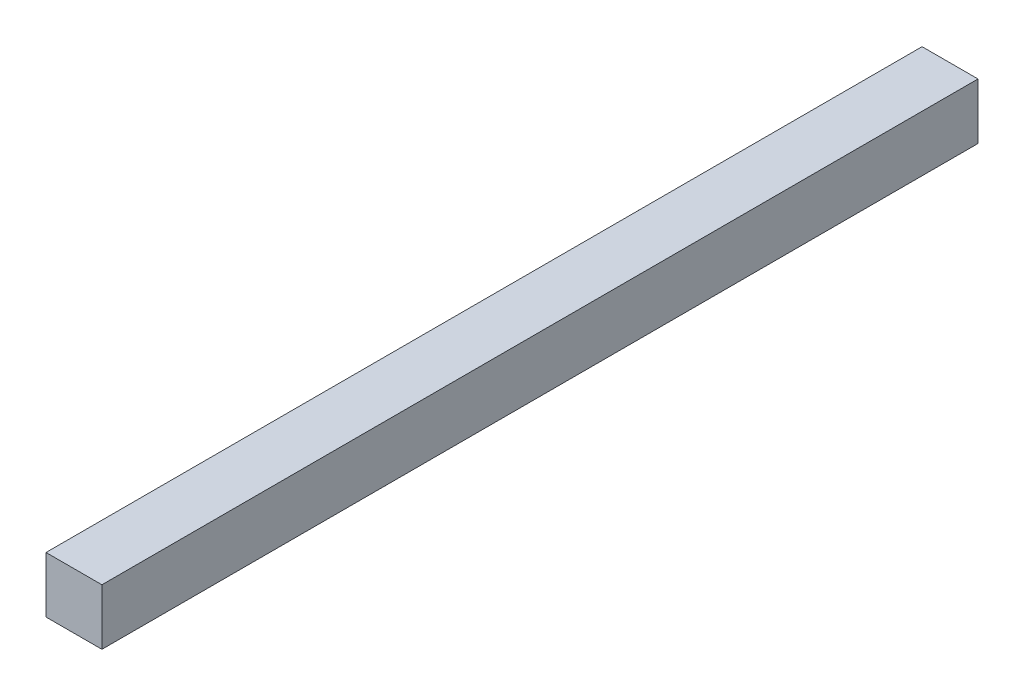
ISO-10303-21;
HEADER;
FILE_DESCRIPTION(('STEP AP214'),'2;1');
FILE_NAME('part.step','',(''),(''),'','','');
FILE_SCHEMA(('AUTOMOTIVE_DESIGN { 1 0 10303 214 1 1 1 1 }'));
ENDSEC;
DATA;
#1=APPLICATION_CONTEXT('core data for automotive mechanical design processes');
#2=APPLICATION_PROTOCOL_DEFINITION('international standard','automotive_design',2000,#1);
#3=PRODUCT_CONTEXT('',#1,'mechanical');
#4=PRODUCT('Part','Part','',(#3));
#5=PRODUCT_RELATED_PRODUCT_CATEGORY('part','',(#4));
#6=PRODUCT_DEFINITION_FORMATION('','',#4);
#7=PRODUCT_DEFINITION_CONTEXT('part definition',#1,'design');
#8=PRODUCT_DEFINITION('design','',#6,#7);
#9=PRODUCT_DEFINITION_SHAPE('','',#8);
#10=(LENGTH_UNIT() NAMED_UNIT(*) SI_UNIT(.MILLI.,.METRE.));
#11=(NAMED_UNIT(*) PLANE_ANGLE_UNIT() SI_UNIT($,.RADIAN.));
#12=(NAMED_UNIT(*) SI_UNIT($,.STERADIAN.) SOLID_ANGLE_UNIT());
#13=UNCERTAINTY_MEASURE_WITH_UNIT(LENGTH_MEASURE(1.E-05),#10,'distance_accuracy_value','');
#14=(GEOMETRIC_REPRESENTATION_CONTEXT(3) GLOBAL_UNCERTAINTY_ASSIGNED_CONTEXT((#13)) GLOBAL_UNIT_ASSIGNED_CONTEXT((#10,
#11,#12)) REPRESENTATION_CONTEXT('',''));
#15=CARTESIAN_POINT('',(0.,0.,0.));
#16=DIRECTION('',(0.,0.,1.));
#17=DIRECTION('',(1.,0.,0.));
#18=AXIS2_PLACEMENT_3D('',#15,#16,#17);
#19=CARTESIAN_POINT('',(-19.5762350936968,22.7172061328773,470.));
#20=DIRECTION('',(1.,0.,0.));
#21=DIRECTION('',(0.,1.,0.));
#22=AXIS2_PLACEMENT_3D('',#19,#20,#21);
#23=PLANE('',#22);
#24=DIRECTION('',(0.,-1.,0.));
#25=VECTOR('',#24,1.);
#26=CARTESIAN_POINT('',(-19.5762350936968,22.7172061328773,0.));
#27=LINE('',#26,#25);
#28=CARTESIAN_POINT('',(-19.5762350936968,22.7172061328773,0.));
#29=VERTEX_POINT('',#28);
#30=CARTESIAN_POINT('',(-19.5762350936968,-7.2827938671227,0.));
#31=VERTEX_POINT('',#30);
#32=EDGE_CURVE('E96',#29,#31,#27,.T.);
#33=ORIENTED_EDGE('',*,*,#32,.T.);
#34=DIRECTION('',(0.,0.,-1.));
#35=VECTOR('',#34,1.);
#36=CARTESIAN_POINT('',(-19.5762350936968,-7.2827938671227,470.));
#37=LINE('',#36,#35);
#38=CARTESIAN_POINT('',(-19.5762350936968,-7.2827938671227,470.));
#39=VERTEX_POINT('',#38);
#40=EDGE_CURVE('E11',#39,#31,#37,.T.);
#41=ORIENTED_EDGE('',*,*,#40,.F.);
#42=DIRECTION('',(0.,-1.,0.));
#43=VECTOR('',#42,1.);
#44=CARTESIAN_POINT('',(-19.5762350936968,22.7172061328773,470.));
#45=LINE('',#44,#43);
#46=CARTESIAN_POINT('',(-19.5762350936968,22.7172061328773,470.));
#47=VERTEX_POINT('',#46);
#48=EDGE_CURVE('E84',#47,#39,#45,.T.);
#49=ORIENTED_EDGE('',*,*,#48,.F.);
#50=DIRECTION('',(0.,0.,-1.));
#51=VECTOR('',#50,1.);
#52=CARTESIAN_POINT('',(-19.5762350936968,22.7172061328773,470.));
#53=LINE('',#52,#51);
#54=EDGE_CURVE('E92',#47,#29,#53,.T.);
#55=ORIENTED_EDGE('',*,*,#54,.T.);
#56=EDGE_LOOP('',(#33,#41,#49,#55));
#57=FACE_BOUND('',#56,.T.);
#58=ADVANCED_FACE('F33',(#57),#23,.F.);
#59=CARTESIAN_POINT('',(-19.5762350936968,-7.2827938671227,470.));
#60=DIRECTION('',(0.,1.,0.));
#61=DIRECTION('',(0.,0.,1.));
#62=AXIS2_PLACEMENT_3D('',#59,#60,#61);
#63=PLANE('',#62);
#64=DIRECTION('',(1.,0.,0.));
#65=VECTOR('',#64,1.);
#66=CARTESIAN_POINT('',(-19.5762350936968,-7.2827938671227,0.));
#67=LINE('',#66,#65);
#68=CARTESIAN_POINT('',(10.4237649063032,-7.2827938671227,0.));
#69=VERTEX_POINT('',#68);
#70=EDGE_CURVE('E88',#31,#69,#67,.T.);
#71=ORIENTED_EDGE('',*,*,#70,.T.);
#72=DIRECTION('',(0.,0.,-1.));
#73=VECTOR('',#72,1.);
#74=CARTESIAN_POINT('',(10.4237649063032,-7.2827938671227,470.));
#75=LINE('',#74,#73);
#76=CARTESIAN_POINT('',(10.4237649063032,-7.2827938671227,470.));
#77=VERTEX_POINT('',#76);
#78=EDGE_CURVE('E41',#77,#69,#75,.T.);
#79=ORIENTED_EDGE('',*,*,#78,.F.);
#80=DIRECTION('',(1.,0.,0.));
#81=VECTOR('',#80,1.);
#82=CARTESIAN_POINT('',(-19.5762350936968,-7.2827938671227,470.));
#83=LINE('',#82,#81);
#84=EDGE_CURVE('E79',#39,#77,#83,.T.);
#85=ORIENTED_EDGE('',*,*,#84,.F.);
#86=ORIENTED_EDGE('',*,*,#40,.T.);
#87=EDGE_LOOP('',(#71,#79,#85,#86));
#88=FACE_BOUND('',#87,.T.);
#89=ADVANCED_FACE('F87',(#88),#63,.F.);
#90=CARTESIAN_POINT('',(10.4237649063032,22.7172061328773,470.));
#91=DIRECTION('',(-1.,0.,0.));
#92=DIRECTION('',(0.,-1.,0.));
#93=AXIS2_PLACEMENT_3D('',#90,#91,#92);
#94=PLANE('',#93);
#95=DIRECTION('',(0.,1.,0.));
#96=VECTOR('',#95,1.);
#97=CARTESIAN_POINT('',(10.4237649063032,22.7172061328773,0.));
#98=LINE('',#97,#96);
#99=CARTESIAN_POINT('',(10.4237649063032,22.7172061328773,0.));
#100=VERTEX_POINT('',#99);
#101=EDGE_CURVE('E66',#69,#100,#98,.T.);
#102=ORIENTED_EDGE('',*,*,#101,.T.);
#103=DIRECTION('',(0.,0.,-1.));
#104=VECTOR('',#103,1.);
#105=CARTESIAN_POINT('',(10.4237649063032,22.7172061328773,470.));
#106=LINE('',#105,#104);
#107=CARTESIAN_POINT('',(10.4237649063032,22.7172061328773,470.));
#108=VERTEX_POINT('',#107);
#109=EDGE_CURVE('E89',#108,#100,#106,.T.);
#110=ORIENTED_EDGE('',*,*,#109,.F.);
#111=DIRECTION('',(0.,1.,0.));
#112=VECTOR('',#111,1.);
#113=CARTESIAN_POINT('',(10.4237649063032,22.7172061328773,470.));
#114=LINE('',#113,#112);
#115=EDGE_CURVE('E82',#77,#108,#114,.T.);
#116=ORIENTED_EDGE('',*,*,#115,.F.);
#117=ORIENTED_EDGE('',*,*,#78,.T.);
#118=EDGE_LOOP('',(#102,#110,#116,#117));
#119=FACE_BOUND('',#118,.T.);
#120=ADVANCED_FACE('F90',(#119),#94,.F.);
#121=CARTESIAN_POINT('',(-19.5762350936968,22.7172061328773,470.));
#122=DIRECTION('',(0.,-1.,0.));
#123=DIRECTION('',(0.,0.,-1.));
#124=AXIS2_PLACEMENT_3D('',#121,#122,#123);
#125=PLANE('',#124);
#126=DIRECTION('',(-1.,0.,0.));
#127=VECTOR('',#126,1.);
#128=CARTESIAN_POINT('',(-19.5762350936968,22.7172061328773,0.));
#129=LINE('',#128,#127);
#130=EDGE_CURVE('E72',#100,#29,#129,.T.);
#131=ORIENTED_EDGE('',*,*,#130,.T.);
#132=ORIENTED_EDGE('',*,*,#54,.F.);
#133=DIRECTION('',(-1.,0.,0.));
#134=VECTOR('',#133,1.);
#135=CARTESIAN_POINT('',(-19.5762350936968,22.7172061328773,470.));
#136=LINE('',#135,#134);
#137=EDGE_CURVE('E49',#108,#47,#136,.T.);
#138=ORIENTED_EDGE('',*,*,#137,.F.);
#139=ORIENTED_EDGE('',*,*,#109,.T.);
#140=EDGE_LOOP('',(#131,#132,#138,#139));
#141=FACE_BOUND('',#140,.T.);
#142=ADVANCED_FACE('F103',(#141),#125,.F.);
#143=CARTESIAN_POINT('',(0.,0.,470.));
#144=DIRECTION('',(0.,0.,1.));
#145=DIRECTION('',(1.,0.,0.));
#146=AXIS2_PLACEMENT_3D('',#143,#144,#145);
#147=PLANE('',#146);
#148=ORIENTED_EDGE('',*,*,#48,.T.);
#149=ORIENTED_EDGE('',*,*,#84,.T.);
#150=ORIENTED_EDGE('',*,*,#115,.T.);
#151=ORIENTED_EDGE('',*,*,#137,.T.);
#152=EDGE_LOOP('',(#148,#149,#150,#151));
#153=FACE_BOUND('',#152,.T.);
#154=ADVANCED_FACE('F80',(#153),#147,.T.);
#155=CARTESIAN_POINT('',(0.,0.,0.));
#156=DIRECTION('',(0.,0.,1.));
#157=DIRECTION('',(1.,0.,0.));
#158=AXIS2_PLACEMENT_3D('',#155,#156,#157);
#159=PLANE('',#158);
#160=ORIENTED_EDGE('',*,*,#32,.F.);
#161=ORIENTED_EDGE('',*,*,#130,.F.);
#162=ORIENTED_EDGE('',*,*,#101,.F.);
#163=ORIENTED_EDGE('',*,*,#70,.F.);
#164=EDGE_LOOP('',(#160,#161,#162,#163));
#165=FACE_BOUND('',#164,.T.);
#166=ADVANCED_FACE('F106',(#165),#159,.F.);
#167=CLOSED_SHELL('',(#58,#89,#120,#142,#154,#166));
#168=MANIFOLD_SOLID_BREP('B2',#167);
#169=ADVANCED_BREP_SHAPE_REPRESENTATION('',(#18,#168),#14);
#170=SHAPE_DEFINITION_REPRESENTATION(#9,#169);
ENDSEC;
END-ISO-10303-21;
